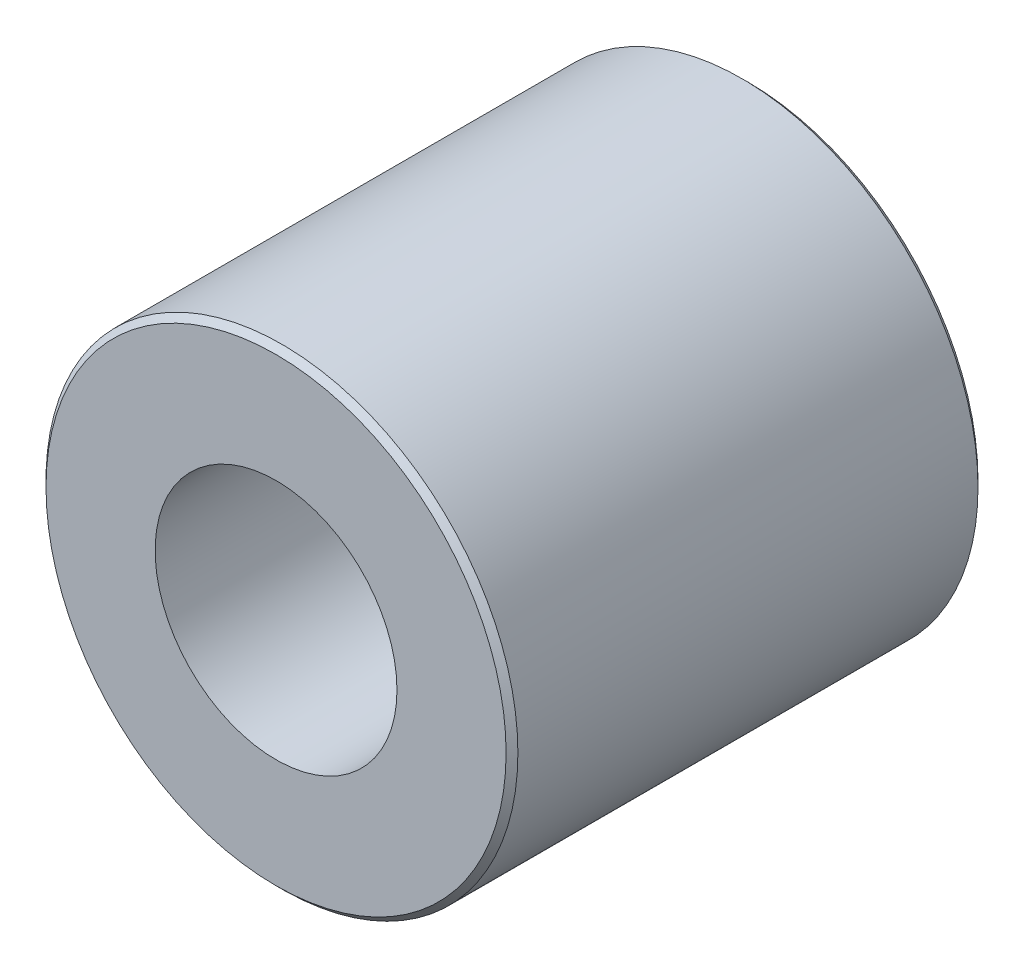
ISO-10303-21;
HEADER;
FILE_DESCRIPTION(('STEP AP214'),'2;1');
FILE_NAME('part.step','',(''),(''),'','','');
FILE_SCHEMA(('AUTOMOTIVE_DESIGN { 1 0 10303 214 1 1 1 1 }'));
ENDSEC;
DATA;
#1=APPLICATION_CONTEXT('core data for automotive mechanical design processes');
#2=APPLICATION_PROTOCOL_DEFINITION('international standard','automotive_design',2000,#1);
#3=PRODUCT_CONTEXT('',#1,'mechanical');
#4=PRODUCT('Part','Part','',(#3));
#5=PRODUCT_RELATED_PRODUCT_CATEGORY('part','',(#4));
#6=PRODUCT_DEFINITION_FORMATION('','',#4);
#7=PRODUCT_DEFINITION_CONTEXT('part definition',#1,'design');
#8=PRODUCT_DEFINITION('design','',#6,#7);
#9=PRODUCT_DEFINITION_SHAPE('','',#8);
#10=(LENGTH_UNIT() NAMED_UNIT(*) SI_UNIT(.MILLI.,.METRE.));
#11=(NAMED_UNIT(*) PLANE_ANGLE_UNIT() SI_UNIT($,.RADIAN.));
#12=(NAMED_UNIT(*) SI_UNIT($,.STERADIAN.) SOLID_ANGLE_UNIT());
#13=UNCERTAINTY_MEASURE_WITH_UNIT(LENGTH_MEASURE(1.E-05),#10,'distance_accuracy_value','');
#14=(GEOMETRIC_REPRESENTATION_CONTEXT(3) GLOBAL_UNCERTAINTY_ASSIGNED_CONTEXT((#13)) GLOBAL_UNIT_ASSIGNED_CONTEXT((#10,
#11,#12)) REPRESENTATION_CONTEXT('',''));
#15=CARTESIAN_POINT('',(0.,0.,0.));
#16=DIRECTION('',(0.,0.,1.));
#17=DIRECTION('',(1.,0.,0.));
#18=AXIS2_PLACEMENT_3D('',#15,#16,#17);
#19=CARTESIAN_POINT('',(0.,0.,4.));
#20=DIRECTION('',(0.,0.,1.));
#21=DIRECTION('',(1.,0.,0.));
#22=AXIS2_PLACEMENT_3D('',#19,#20,#21);
#23=PLANE('',#22);
#24=CARTESIAN_POINT('',(0.,0.,4.));
#25=DIRECTION('',(0.,0.,1.));
#26=DIRECTION('',(1.,0.,0.));
#27=AXIS2_PLACEMENT_3D('',#24,#25,#26);
#28=CIRCLE('',#27,1.02499999999999);
#29=CARTESIAN_POINT('',(1.02499999999999,0.,4.));
#30=VERTEX_POINT('',#29);
#31=EDGE_CURVE('E57',#30,#30,#28,.T.);
#32=ORIENTED_EDGE('',*,*,#31,.F.);
#33=EDGE_LOOP('',(#32));
#34=FACE_BOUND('',#33,.T.);
#35=CARTESIAN_POINT('',(0.,0.,4.));
#36=DIRECTION('',(0.,0.,1.));
#37=DIRECTION('',(1.,0.,0.));
#38=AXIS2_PLACEMENT_3D('',#35,#36,#37);
#39=CIRCLE('',#38,1.95);
#40=CARTESIAN_POINT('',(1.95,0.,4.));
#41=VERTEX_POINT('',#40);
#42=EDGE_CURVE('E10',#41,#41,#39,.T.);
#43=ORIENTED_EDGE('',*,*,#42,.T.);
#44=EDGE_LOOP('',(#43));
#45=FACE_BOUND('',#44,.T.);
#46=ADVANCED_FACE('F34',(#34,#45),#23,.T.);
#47=CARTESIAN_POINT('',(0.,0.,0.));
#48=DIRECTION('',(0.,0.,1.));
#49=DIRECTION('',(1.,0.,0.));
#50=AXIS2_PLACEMENT_3D('',#47,#48,#49);
#51=PLANE('',#50);
#52=CARTESIAN_POINT('',(0.,0.,0.));
#53=DIRECTION('',(0.,0.,1.));
#54=DIRECTION('',(1.,0.,0.));
#55=AXIS2_PLACEMENT_3D('',#52,#53,#54);
#56=CIRCLE('',#55,1.025);
#57=CARTESIAN_POINT('',(1.025,0.,0.));
#58=VERTEX_POINT('',#57);
#59=EDGE_CURVE('E54',#58,#58,#56,.T.);
#60=ORIENTED_EDGE('',*,*,#59,.T.);
#61=EDGE_LOOP('',(#60));
#62=FACE_BOUND('',#61,.T.);
#63=CARTESIAN_POINT('',(0.,0.,0.));
#64=DIRECTION('',(0.,0.,1.));
#65=DIRECTION('',(1.,0.,0.));
#66=AXIS2_PLACEMENT_3D('',#63,#64,#65);
#67=CIRCLE('',#66,1.95);
#68=CARTESIAN_POINT('',(1.95,0.,0.));
#69=VERTEX_POINT('',#68);
#70=EDGE_CURVE('E41',#69,#69,#67,.F.);
#71=ORIENTED_EDGE('',*,*,#70,.T.);
#72=EDGE_LOOP('',(#71));
#73=FACE_BOUND('',#72,.T.);
#74=ADVANCED_FACE('F64',(#62,#73),#51,.F.);
#75=CARTESIAN_POINT('',(0.,0.,4.));
#76=DIRECTION('',(0.,0.,-1.));
#77=DIRECTION('',(-1.,0.,0.));
#78=AXIS2_PLACEMENT_3D('',#75,#76,#77);
#79=CYLINDRICAL_SURFACE('',#78,2.);
#80=CARTESIAN_POINT('',(0.,0.,0.049999999999998));
#81=DIRECTION('',(0.,0.,1.));
#82=DIRECTION('',(1.,0.,0.));
#83=AXIS2_PLACEMENT_3D('',#80,#81,#82);
#84=CIRCLE('',#83,2.);
#85=CARTESIAN_POINT('',(2.,0.,0.049999999999998));
#86=VERTEX_POINT('',#85);
#87=EDGE_CURVE('E45',#86,#86,#84,.T.);
#88=ORIENTED_EDGE('',*,*,#87,.T.);
#89=EDGE_LOOP('',(#88));
#90=FACE_BOUND('',#89,.T.);
#91=CARTESIAN_POINT('',(0.,0.,3.95));
#92=DIRECTION('',(0.,0.,1.));
#93=DIRECTION('',(1.,0.,0.));
#94=AXIS2_PLACEMENT_3D('',#91,#92,#93);
#95=CIRCLE('',#94,2.);
#96=CARTESIAN_POINT('',(2.,0.,3.95));
#97=VERTEX_POINT('',#96);
#98=EDGE_CURVE('E49',#97,#97,#95,.F.);
#99=ORIENTED_EDGE('',*,*,#98,.T.);
#100=EDGE_LOOP('',(#99));
#101=FACE_BOUND('',#100,.T.);
#102=ADVANCED_FACE('F69',(#90,#101),#79,.T.);
#103=CARTESIAN_POINT('',(0.,0.,0.049999999999998));
#104=DIRECTION('',(0.,0.,1.));
#105=DIRECTION('',(1.,0.,0.));
#106=AXIS2_PLACEMENT_3D('',#103,#104,#105);
#107=CONICAL_SURFACE('',#106,2.,0.785398163397453);
#108=ORIENTED_EDGE('',*,*,#70,.F.);
#109=EDGE_LOOP('',(#108));
#110=FACE_BOUND('',#109,.T.);
#111=ORIENTED_EDGE('',*,*,#87,.F.);
#112=EDGE_LOOP('',(#111));
#113=FACE_BOUND('',#112,.T.);
#114=ADVANCED_FACE('F75',(#110,#113),#107,.T.);
#115=CARTESIAN_POINT('',(0.,0.,4.));
#116=DIRECTION('',(0.,0.,-1.));
#117=DIRECTION('',(-1.,0.,0.));
#118=AXIS2_PLACEMENT_3D('',#115,#116,#117);
#119=CONICAL_SURFACE('',#118,1.95,0.785398163397448);
#120=ORIENTED_EDGE('',*,*,#98,.F.);
#121=EDGE_LOOP('',(#120));
#122=FACE_BOUND('',#121,.T.);
#123=ORIENTED_EDGE('',*,*,#42,.F.);
#124=EDGE_LOOP('',(#123));
#125=FACE_BOUND('',#124,.T.);
#126=ADVANCED_FACE('F36',(#122,#125),#119,.T.);
#127=CARTESIAN_POINT('',(0.,0.,4.));
#128=DIRECTION('',(0.,0.,1.));
#129=DIRECTION('',(1.,0.,0.));
#130=AXIS2_PLACEMENT_3D('',#127,#128,#129);
#131=CYLINDRICAL_SURFACE('',#130,1.02499999999999);
#132=ORIENTED_EDGE('',*,*,#59,.F.);
#133=EDGE_LOOP('',(#132));
#134=FACE_BOUND('',#133,.T.);
#135=ORIENTED_EDGE('',*,*,#31,.T.);
#136=EDGE_LOOP('',(#135));
#137=FACE_BOUND('',#136,.T.);
#138=ADVANCED_FACE('F61',(#134,#137),#131,.F.);
#139=CLOSED_SHELL('',(#46,#74,#102,#114,#126,#138));
#140=MANIFOLD_SOLID_BREP('B2',#139);
#141=ADVANCED_BREP_SHAPE_REPRESENTATION('',(#18,#140),#14);
#142=SHAPE_DEFINITION_REPRESENTATION(#9,#141);
ENDSEC;
END-ISO-10303-21;
